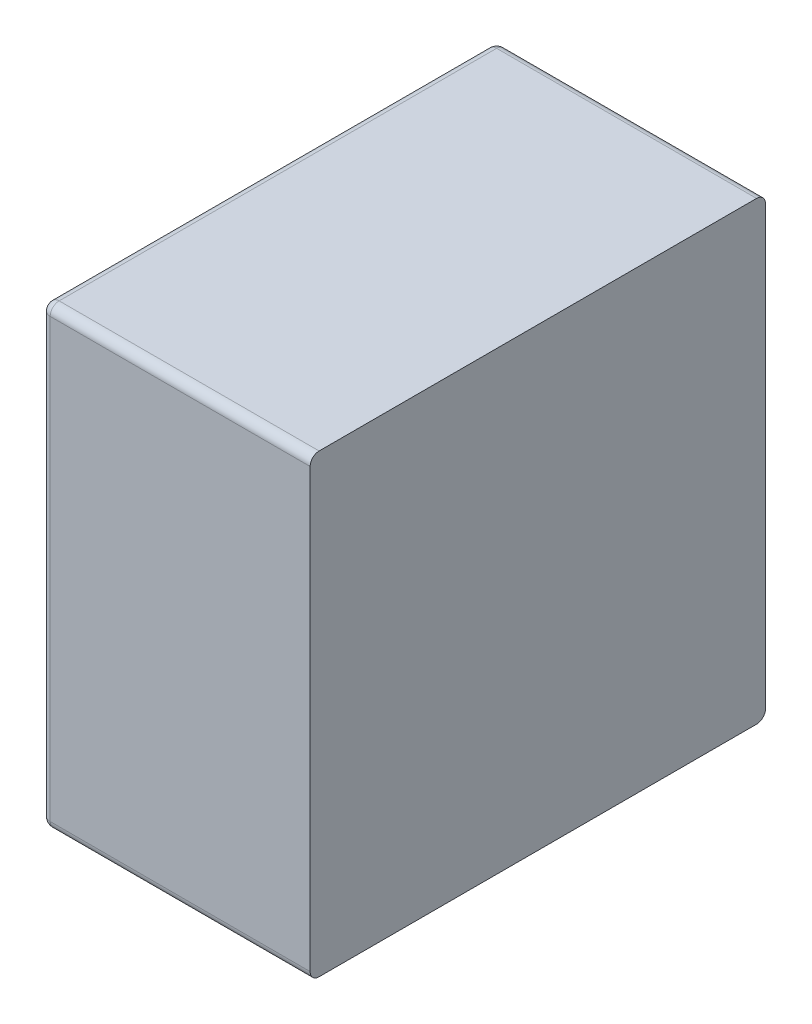
ISO-10303-21;
HEADER;
FILE_DESCRIPTION(('STEP AP214'),'2;1');
FILE_NAME('part.step','',(''),(''),'','','');
FILE_SCHEMA(('AUTOMOTIVE_DESIGN { 1 0 10303 214 1 1 1 1 }'));
ENDSEC;
DATA;
#1=APPLICATION_CONTEXT('core data for automotive mechanical design processes');
#2=APPLICATION_PROTOCOL_DEFINITION('international standard','automotive_design',2000,#1);
#3=PRODUCT_CONTEXT('',#1,'mechanical');
#4=PRODUCT('Part','Part','',(#3));
#5=PRODUCT_RELATED_PRODUCT_CATEGORY('part','',(#4));
#6=PRODUCT_DEFINITION_FORMATION('','',#4);
#7=PRODUCT_DEFINITION_CONTEXT('part definition',#1,'design');
#8=PRODUCT_DEFINITION('design','',#6,#7);
#9=PRODUCT_DEFINITION_SHAPE('','',#8);
#10=(LENGTH_UNIT() NAMED_UNIT(*) SI_UNIT(.MILLI.,.METRE.));
#11=(NAMED_UNIT(*) PLANE_ANGLE_UNIT() SI_UNIT($,.RADIAN.));
#12=(NAMED_UNIT(*) SI_UNIT($,.STERADIAN.) SOLID_ANGLE_UNIT());
#13=UNCERTAINTY_MEASURE_WITH_UNIT(LENGTH_MEASURE(1.E-05),#10,'distance_accuracy_value','');
#14=(GEOMETRIC_REPRESENTATION_CONTEXT(3) GLOBAL_UNCERTAINTY_ASSIGNED_CONTEXT((#13)) GLOBAL_UNIT_ASSIGNED_CONTEXT((#10,
#11,#12)) REPRESENTATION_CONTEXT('',''));
#15=CARTESIAN_POINT('',(0.,0.,0.));
#16=DIRECTION('',(0.,0.,1.));
#17=DIRECTION('',(1.,0.,0.));
#18=AXIS2_PLACEMENT_3D('',#15,#16,#17);
#19=CARTESIAN_POINT('',(20.678297040119,30.214336876006,0.04998827587816));
#20=DIRECTION('',(-0.57735016824285,-0.57735037013685,-0.57735026918916));
#21=DIRECTION('',(-0.707106904820968,0.707106657552106,2.21433982261487E-13));
#22=AXIS2_PLACEMENT_3D('',#19,#20,#21);
#23=SPHERICAL_SURFACE('',#22,0.05);
#24=CARTESIAN_POINT('',(20.6494295317069,30.1854693574992,0.0211207624187029));
#25=VERTEX_POINT('',#24);
#26=VERTEX_LOOP('',#25);
#27=FACE_BOUND('',#26,.T.);
#28=CARTESIAN_POINT('',(20.6782970401187,30.2143368760062,0.0499882758781601));
#29=DIRECTION('',(0.999999999999985,1.74845553146897E-07,0.));
#30=DIRECTION('',(-1.74845553146897E-07,0.999999999999985,0.));
#31=AXIS2_PLACEMENT_3D('',#28,#29,#30);
#32=CIRCLE('',#31,0.05);
#33=CARTESIAN_POINT('',(20.6782970488611,30.1643368760057,0.04998827587816));
#34=VERTEX_POINT('',#33);
#35=CARTESIAN_POINT('',(20.6782968268074,30.2143368760061,-1.17241209315826E-05));
#36=VERTEX_POINT('',#35);
#37=EDGE_CURVE('E110',#34,#36,#32,.T.);
#38=ORIENTED_EDGE('',*,*,#37,.F.);
#39=CARTESIAN_POINT('',(20.678297040119,30.214336876006,0.04998827587816));
#40=DIRECTION('',(0.,0.,1.));
#41=DIRECTION('',(1.,0.,0.));
#42=AXIS2_PLACEMENT_3D('',#39,#40,#41);
#43=CIRCLE('',#42,0.05);
#44=CARTESIAN_POINT('',(20.6282970401188,30.2143368672634,0.04998827587816));
#45=VERTEX_POINT('',#44);
#46=EDGE_CURVE('E21',#45,#34,#43,.T.);
#47=ORIENTED_EDGE('',*,*,#46,.F.);
#48=CARTESIAN_POINT('',(20.6782970401185,30.214336876006,0.0499882758781601));
#49=DIRECTION('',(1.74845553256197E-07,-0.999999999999985,0.));
#50=DIRECTION('',(0.999999999999985,1.74845553256197E-07,0.));
#51=AXIS2_PLACEMENT_3D('',#48,#49,#50);
#52=CIRCLE('',#51,0.05);
#53=EDGE_CURVE('E111',#36,#45,#52,.F.);
#54=ORIENTED_EDGE('',*,*,#53,.F.);
#55=EDGE_LOOP('',(#38,#47,#54));
#56=FACE_BOUND('',#55,.T.);
#57=ADVANCED_FACE('F17',(#27,#56),#23,.T.);
#58=CARTESIAN_POINT('',(20.678296613496,32.654336876006,0.04998827587816));
#59=DIRECTION('',(-0.57735037013735,0.57735016824235,-0.57735026918916));
#60=DIRECTION('',(0.707106657551697,0.707106904821376,-1.86822779468798E-13));
#61=AXIS2_PLACEMENT_3D('',#58,#59,#60);
#62=SPHERICAL_SURFACE('',#61,0.05);
#63=CARTESIAN_POINT('',(20.6494290949891,32.6832043844181,0.0211207624187029));
#64=VERTEX_POINT('',#63);
#65=VERTEX_LOOP('',#64);
#66=FACE_BOUND('',#65,.T.);
#67=CARTESIAN_POINT('',(20.678296613496,32.654336876006,0.0499882758781503));
#68=DIRECTION('',(-0.999999999999985,-1.74845553146897E-07,0.));
#69=DIRECTION('',(1.74845553146897E-07,-0.999999999999985,0.));
#70=AXIS2_PLACEMENT_3D('',#67,#68,#69);
#71=CIRCLE('',#70,0.05);
#72=CARTESIAN_POINT('',(20.6782966134957,32.6543370027686,-1.17241218441212E-05));
#73=VERTEX_POINT('',#72);
#74=CARTESIAN_POINT('',(20.6782966047539,32.704336876006,0.049988275878155));
#75=VERTEX_POINT('',#74);
#76=EDGE_CURVE('E192',#73,#75,#71,.F.);
#77=ORIENTED_EDGE('',*,*,#76,.F.);
#78=CARTESIAN_POINT('',(20.6782966134954,32.6543368760053,0.04998827587816));
#79=DIRECTION('',(1.74845553256197E-07,-0.999999999999985,0.));
#80=DIRECTION('',(0.999999999999985,1.74845553256197E-07,0.));
#81=AXIS2_PLACEMENT_3D('',#78,#79,#80);
#82=CIRCLE('',#81,0.05);
#83=CARTESIAN_POINT('',(20.6282966134957,32.6543368672634,0.04998827587816));
#84=VERTEX_POINT('',#83);
#85=EDGE_CURVE('E200',#84,#73,#82,.T.);
#86=ORIENTED_EDGE('',*,*,#85,.F.);
#87=CARTESIAN_POINT('',(20.678296613496,32.654336876006,0.04998827587816));
#88=DIRECTION('',(0.,0.,1.));
#89=DIRECTION('',(1.,0.,0.));
#90=AXIS2_PLACEMENT_3D('',#87,#88,#89);
#91=CIRCLE('',#90,0.05);
#92=EDGE_CURVE('E172',#75,#84,#91,.T.);
#93=ORIENTED_EDGE('',*,*,#92,.F.);
#94=EDGE_LOOP('',(#77,#86,#93));
#95=FACE_BOUND('',#94,.T.);
#96=ADVANCED_FACE('F108',(#66,#95),#62,.T.);
#97=CARTESIAN_POINT('',(20.628296604754,32.704336867263,-1.172412184487E-05));
#98=DIRECTION('',(-0.999999999999985,-1.74845553256197E-07,0.));
#99=DIRECTION('',(1.74845553256197E-07,-0.999999999999985,0.));
#100=AXIS2_PLACEMENT_3D('',#97,#98,#99);
#101=PLANE('',#100);
#102=DIRECTION('',(0.,0.,1.));
#103=VECTOR('',#102,1.);
#104=CARTESIAN_POINT('',(20.628297040119,30.214336867263,-1.1724121844787E-05));
#105=LINE('',#104,#103);
#106=CARTESIAN_POINT('',(20.6282970401188,30.2143368672634,2.489988275878));
#107=VERTEX_POINT('',#106);
#108=EDGE_CURVE('E117',#107,#45,#105,.F.);
#109=ORIENTED_EDGE('',*,*,#108,.F.);
#110=DIRECTION('',(1.74845553256197E-07,-0.999999999999985,0.));
#111=VECTOR('',#110,1.);
#112=CARTESIAN_POINT('',(20.62829671578,32.0693368672637,2.489988275878));
#113=LINE('',#112,#111);
#114=CARTESIAN_POINT('',(20.6282966134957,32.6543368672634,2.489988275878));
#115=VERTEX_POINT('',#114);
#116=EDGE_CURVE('E167',#115,#107,#113,.T.);
#117=ORIENTED_EDGE('',*,*,#116,.F.);
#118=DIRECTION('',(0.,0.,1.));
#119=VECTOR('',#118,1.);
#120=CARTESIAN_POINT('',(20.628296613496,32.654336867263,-1.1724121844867E-05));
#121=LINE('',#120,#119);
#122=EDGE_CURVE('E168',#84,#115,#121,.T.);
#123=ORIENTED_EDGE('',*,*,#122,.F.);
#124=DIRECTION('',(1.74845553256197E-07,-0.999999999999985,0.));
#125=VECTOR('',#124,1.);
#126=CARTESIAN_POINT('',(20.62829671578,32.0693368672637,0.0499882758781599));
#127=LINE('',#126,#125);
#128=EDGE_CURVE('E173',#45,#84,#127,.F.);
#129=ORIENTED_EDGE('',*,*,#128,.F.);
#130=EDGE_LOOP('',(#109,#117,#123,#129));
#131=FACE_BOUND('',#130,.T.);
#132=ADVANCED_FACE('F159',(#131),#101,.T.);
#133=CARTESIAN_POINT('',(20.678297040119,30.214336876006,2.489988275878));
#134=DIRECTION('',(-0.577350168242579,-0.577350370136641,0.577350269189641));
#135=DIRECTION('',(-1.2363454196529E-07,0.707106781186642,0.707106781186442));
#136=AXIS2_PLACEMENT_3D('',#133,#134,#135);
#137=SPHERICAL_SURFACE('',#136,0.05);
#138=CARTESIAN_POINT('',(20.6494295317069,30.1854693574992,2.51885578933748));
#139=VERTEX_POINT('',#138);
#140=VERTEX_LOOP('',#139);
#141=FACE_BOUND('',#140,.T.);
#142=CARTESIAN_POINT('',(20.678297040119,30.2143368760062,2.489988275878));
#143=DIRECTION('',(0.999999999999985,1.74845553146897E-07,0.));
#144=DIRECTION('',(-1.74845553146897E-07,0.999999999999985,0.));
#145=AXIS2_PLACEMENT_3D('',#142,#143,#144);
#146=CIRCLE('',#145,0.05);
#147=CARTESIAN_POINT('',(20.6782968268075,30.2143368760056,2.539988275878));
#148=VERTEX_POINT('',#147);
#149=CARTESIAN_POINT('',(20.6782970488611,30.1643368760057,2.489988275878));
#150=VERTEX_POINT('',#149);
#151=EDGE_CURVE('E182',#148,#150,#146,.T.);
#152=ORIENTED_EDGE('',*,*,#151,.F.);
#153=CARTESIAN_POINT('',(20.6782970401185,30.2143368760053,2.489988275878));
#154=DIRECTION('',(1.74845553256197E-07,-0.999999999999985,0.));
#155=DIRECTION('',(0.999999999999985,1.74845553256197E-07,0.));
#156=AXIS2_PLACEMENT_3D('',#153,#154,#155);
#157=CIRCLE('',#156,0.05);
#158=EDGE_CURVE('E184',#107,#148,#157,.F.);
#159=ORIENTED_EDGE('',*,*,#158,.F.);
#160=CARTESIAN_POINT('',(20.678297040119,30.214336876006,2.489988275878));
#161=DIRECTION('',(0.,0.,1.));
#162=DIRECTION('',(1.,0.,0.));
#163=AXIS2_PLACEMENT_3D('',#160,#161,#162);
#164=CIRCLE('',#163,0.05);
#165=EDGE_CURVE('E127',#150,#107,#164,.F.);
#166=ORIENTED_EDGE('',*,*,#165,.F.);
#167=EDGE_LOOP('',(#152,#159,#166));
#168=FACE_BOUND('',#167,.T.);
#169=ADVANCED_FACE('F155',(#141,#168),#137,.T.);
#170=CARTESIAN_POINT('',(20.678296613496,32.654336876006,2.489988275878));
#171=DIRECTION('',(-0.577350370136641,0.577350168242579,0.577350269189641));
#172=DIRECTION('',(-0.707106781186642,-1.2363454196529E-07,-0.707106781186442));
#173=AXIS2_PLACEMENT_3D('',#170,#171,#172);
#174=SPHERICAL_SURFACE('',#173,0.05);
#175=CARTESIAN_POINT('',(20.6494290949892,32.6832043844181,2.51885578933748));
#176=VERTEX_POINT('',#175);
#177=VERTEX_LOOP('',#176);
#178=FACE_BOUND('',#177,.T.);
#179=CARTESIAN_POINT('',(20.6782966134963,32.654336876006,2.489988275878));
#180=DIRECTION('',(-0.999999999999985,-1.74845553146897E-07,0.));
#181=DIRECTION('',(1.74845553146897E-07,-0.999999999999985,0.));
#182=AXIS2_PLACEMENT_3D('',#179,#180,#181);
#183=CIRCLE('',#182,0.05);
#184=CARTESIAN_POINT('',(20.6782966047539,32.704336876006,2.489988275878));
#185=VERTEX_POINT('',#184);
#186=CARTESIAN_POINT('',(20.6782966134958,32.654337002769,2.53998827587768));
#187=VERTEX_POINT('',#186);
#188=EDGE_CURVE('E140',#185,#187,#183,.F.);
#189=ORIENTED_EDGE('',*,*,#188,.F.);
#190=CARTESIAN_POINT('',(20.678296613496,32.654336876006,2.489988275878));
#191=DIRECTION('',(0.,0.,1.));
#192=DIRECTION('',(1.,0.,0.));
#193=AXIS2_PLACEMENT_3D('',#190,#191,#192);
#194=CIRCLE('',#193,0.05);
#195=EDGE_CURVE('E171',#115,#185,#194,.F.);
#196=ORIENTED_EDGE('',*,*,#195,.F.);
#197=CARTESIAN_POINT('',(20.6782966134954,32.654336876006,2.489988275878));
#198=DIRECTION('',(1.74845553256197E-07,-0.999999999999985,0.));
#199=DIRECTION('',(0.999999999999985,1.74845553256197E-07,0.));
#200=AXIS2_PLACEMENT_3D('',#197,#198,#199);
#201=CIRCLE('',#200,0.05);
#202=EDGE_CURVE('E187',#187,#115,#201,.T.);
#203=ORIENTED_EDGE('',*,*,#202,.F.);
#204=EDGE_LOOP('',(#189,#196,#203));
#205=FACE_BOUND('',#204,.T.);
#206=ADVANCED_FACE('F151',(#178,#205),#174,.T.);
#207=CARTESIAN_POINT('',(20.678297040119,30.214336876006,-1.17241218448E-05));
#208=DIRECTION('',(0.,0.,1.));
#209=DIRECTION('',(1.,0.,0.));
#210=AXIS2_PLACEMENT_3D('',#207,#208,#209);
#211=CYLINDRICAL_SURFACE('',#210,0.05);
#212=ORIENTED_EDGE('',*,*,#165,.T.);
#213=ORIENTED_EDGE('',*,*,#108,.T.);
#214=ORIENTED_EDGE('',*,*,#46,.T.);
#215=DIRECTION('',(0.,0.,1.));
#216=VECTOR('',#215,1.);
#217=CARTESIAN_POINT('',(20.678297048861,30.1643368760053,-1.172412184479E-05));
#218=LINE('',#217,#216);
#219=EDGE_CURVE('E125',#150,#34,#218,.F.);
#220=ORIENTED_EDGE('',*,*,#219,.F.);
#221=EDGE_LOOP('',(#212,#213,#214,#220));
#222=FACE_BOUND('',#221,.T.);
#223=ADVANCED_FACE('F123',(#222),#211,.T.);
#224=CARTESIAN_POINT('',(21.003297040119,30.214336932831,0.04998827587816));
#225=DIRECTION('',(0.999999999999985,1.74845553146897E-07,0.));
#226=DIRECTION('',(-1.74845553146897E-07,0.999999999999985,0.));
#227=AXIS2_PLACEMENT_3D('',#224,#225,#226);
#228=CYLINDRICAL_SURFACE('',#227,0.05);
#229=CARTESIAN_POINT('',(22.128297040119,30.2143371295322,0.0499882758781597));
#230=DIRECTION('',(0.999999999999985,1.74845553146897E-07,0.));
#231=DIRECTION('',(-1.74845553146897E-07,0.999999999999985,0.));
#232=AXIS2_PLACEMENT_3D('',#229,#230,#231);
#233=CIRCLE('',#232,0.05);
#234=CARTESIAN_POINT('',(22.1282970401189,30.2143370027691,-1.17241218451913E-05));
#235=VERTEX_POINT('',#234);
#236=CARTESIAN_POINT('',(22.1282970488613,30.1643371295317,0.0499882758781599));
#237=VERTEX_POINT('',#236);
#238=EDGE_CURVE('E116',#235,#237,#233,.F.);
#239=ORIENTED_EDGE('',*,*,#238,.T.);
#240=DIRECTION('',(0.999999999999985,1.74845553146897E-07,0.));
#241=VECTOR('',#240,1.);
#242=CARTESIAN_POINT('',(20.628297048861,30.164336867263,0.04998827587816));
#243=LINE('',#242,#241);
#244=EDGE_CURVE('E129',#34,#237,#243,.T.);
#245=ORIENTED_EDGE('',*,*,#244,.F.);
#246=ORIENTED_EDGE('',*,*,#37,.T.);
#247=DIRECTION('',(1.,0.,0.));
#248=VECTOR('',#247,1.);
#249=CARTESIAN_POINT('',(21.378296826807,30.214336876006,-1.17241218449783E-05));
#250=LINE('',#249,#248);
#251=EDGE_CURVE('E240',#36,#235,#250,.T.);
#252=ORIENTED_EDGE('',*,*,#251,.T.);
#253=EDGE_LOOP('',(#239,#245,#246,#252));
#254=FACE_BOUND('',#253,.T.);
#255=ADVANCED_FACE('F130',(#254),#228,.T.);
#256=CARTESIAN_POINT('',(20.67829671578,32.069336876006,0.04998827587816));
#257=DIRECTION('',(1.74845553256197E-07,-0.999999999999985,0.));
#258=DIRECTION('',(0.999999999999985,1.74845553256197E-07,0.));
#259=AXIS2_PLACEMENT_3D('',#256,#257,#258);
#260=CYLINDRICAL_SURFACE('',#259,0.05);
#261=ORIENTED_EDGE('',*,*,#53,.T.);
#262=ORIENTED_EDGE('',*,*,#128,.T.);
#263=ORIENTED_EDGE('',*,*,#85,.T.);
#264=DIRECTION('',(0.,1.,0.));
#265=VECTOR('',#264,1.);
#266=CARTESIAN_POINT('',(20.678296613496,31.434336998398,-1.17241218448379E-05));
#267=LINE('',#266,#265);
#268=EDGE_CURVE('E144',#73,#36,#267,.F.);
#269=ORIENTED_EDGE('',*,*,#268,.T.);
#270=EDGE_LOOP('',(#261,#262,#263,#269));
#271=FACE_BOUND('',#270,.T.);
#272=ADVANCED_FACE('F341',(#271),#260,.T.);
#273=CARTESIAN_POINT('',(20.678296613496,32.654336876006,-1.172412184488E-05));
#274=DIRECTION('',(0.,0.,1.));
#275=DIRECTION('',(1.,0.,0.));
#276=AXIS2_PLACEMENT_3D('',#273,#274,#275);
#277=CYLINDRICAL_SURFACE('',#276,0.05);
#278=ORIENTED_EDGE('',*,*,#195,.T.);
#279=DIRECTION('',(0.,0.,1.));
#280=VECTOR('',#279,1.);
#281=CARTESIAN_POINT('',(20.678296604754,32.7043368760059,-1.172412184526E-05));
#282=LINE('',#281,#280);
#283=EDGE_CURVE('E229',#75,#185,#282,.T.);
#284=ORIENTED_EDGE('',*,*,#283,.F.);
#285=ORIENTED_EDGE('',*,*,#92,.T.);
#286=ORIENTED_EDGE('',*,*,#122,.T.);
#287=EDGE_LOOP('',(#278,#284,#285,#286));
#288=FACE_BOUND('',#287,.T.);
#289=ADVANCED_FACE('F332',(#288),#277,.T.);
#290=CARTESIAN_POINT('',(21.753296613496,32.654337063965,0.04998827587815));
#291=DIRECTION('',(-0.999999999999985,-1.74845553146897E-07,0.));
#292=DIRECTION('',(1.74845553146897E-07,-0.999999999999985,0.));
#293=AXIS2_PLACEMENT_3D('',#290,#291,#292);
#294=CYLINDRICAL_SURFACE('',#293,0.05);
#295=CARTESIAN_POINT('',(22.1282966134963,32.6543371295321,0.0499882758781499));
#296=DIRECTION('',(-0.999999999999985,-1.74845553146897E-07,0.));
#297=DIRECTION('',(1.74845553146897E-07,-0.999999999999985,0.));
#298=AXIS2_PLACEMENT_3D('',#295,#296,#297);
#299=CIRCLE('',#298,0.05);
#300=CARTESIAN_POINT('',(22.1282966047536,32.704337129532,0.04998827587815));
#301=VERTEX_POINT('',#300);
#302=CARTESIAN_POINT('',(22.1282966134959,32.654337129532,-1.17241218452121E-05));
#303=VERTEX_POINT('',#302);
#304=EDGE_CURVE('E190',#301,#303,#299,.T.);
#305=ORIENTED_EDGE('',*,*,#304,.T.);
#306=DIRECTION('',(1.,0.,0.));
#307=VECTOR('',#306,1.);
#308=CARTESIAN_POINT('',(21.378296826807,32.654337129532,-1.17241218450617E-05));
#309=LINE('',#308,#307);
#310=EDGE_CURVE('E235',#303,#73,#309,.F.);
#311=ORIENTED_EDGE('',*,*,#310,.T.);
#312=ORIENTED_EDGE('',*,*,#76,.T.);
#313=DIRECTION('',(-0.999999999999985,-1.74845553146897E-07,0.));
#314=VECTOR('',#313,1.);
#315=CARTESIAN_POINT('',(22.128296604754,32.704337129532,0.04998827587815));
#316=LINE('',#315,#314);
#317=EDGE_CURVE('E223',#301,#75,#316,.T.);
#318=ORIENTED_EDGE('',*,*,#317,.F.);
#319=EDGE_LOOP('',(#305,#311,#312,#318));
#320=FACE_BOUND('',#319,.T.);
#321=ADVANCED_FACE('F323',(#320),#294,.T.);
#322=CARTESIAN_POINT('',(20.67829671578,32.069336876006,2.489988275878));
#323=DIRECTION('',(1.74845553256197E-07,-0.999999999999985,0.));
#324=DIRECTION('',(0.999999999999985,1.74845553256197E-07,0.));
#325=AXIS2_PLACEMENT_3D('',#322,#323,#324);
#326=CYLINDRICAL_SURFACE('',#325,0.05);
#327=ORIENTED_EDGE('',*,*,#158,.T.);
#328=DIRECTION('',(0.,1.,0.));
#329=VECTOR('',#328,1.);
#330=CARTESIAN_POINT('',(20.678296613496,31.434336998398,2.539988275878));
#331=LINE('',#330,#329);
#332=EDGE_CURVE('E211',#187,#148,#331,.F.);
#333=ORIENTED_EDGE('',*,*,#332,.F.);
#334=ORIENTED_EDGE('',*,*,#202,.T.);
#335=ORIENTED_EDGE('',*,*,#116,.T.);
#336=EDGE_LOOP('',(#327,#333,#334,#335));
#337=FACE_BOUND('',#336,.T.);
#338=ADVANCED_FACE('F209',(#337),#326,.T.);
#339=CARTESIAN_POINT('',(21.003297040119,30.214336932831,2.489988275878));
#340=DIRECTION('',(0.999999999999985,1.74845553146897E-07,0.));
#341=DIRECTION('',(-1.74845553146897E-07,0.999999999999985,0.));
#342=AXIS2_PLACEMENT_3D('',#339,#340,#341);
#343=CYLINDRICAL_SURFACE('',#342,0.05);
#344=CARTESIAN_POINT('',(22.1282970401187,30.2143371295322,2.489988275878));
#345=DIRECTION('',(0.999999999999985,1.74845553146897E-07,0.));
#346=DIRECTION('',(-1.74845553146897E-07,0.999999999999985,0.));
#347=AXIS2_PLACEMENT_3D('',#344,#345,#346);
#348=CIRCLE('',#347,0.05);
#349=CARTESIAN_POINT('',(22.128297048861,30.1643371295317,2.489988275878));
#350=VERTEX_POINT('',#349);
#351=CARTESIAN_POINT('',(22.1282970401187,30.2143370027691,2.539988275878));
#352=VERTEX_POINT('',#351);
#353=EDGE_CURVE('E180',#350,#352,#348,.F.);
#354=ORIENTED_EDGE('',*,*,#353,.T.);
#355=DIRECTION('',(1.,0.,0.));
#356=VECTOR('',#355,1.);
#357=CARTESIAN_POINT('',(21.378296826807,30.214336876006,2.539988275878));
#358=LINE('',#357,#356);
#359=EDGE_CURVE('E215',#148,#352,#358,.T.);
#360=ORIENTED_EDGE('',*,*,#359,.F.);
#361=ORIENTED_EDGE('',*,*,#151,.T.);
#362=DIRECTION('',(0.999999999999985,1.74845553146897E-07,0.));
#363=VECTOR('',#362,1.);
#364=CARTESIAN_POINT('',(20.628297048861,30.164336867263,2.489988275878));
#365=LINE('',#364,#363);
#366=EDGE_CURVE('E134',#350,#150,#365,.F.);
#367=ORIENTED_EDGE('',*,*,#366,.F.);
#368=EDGE_LOOP('',(#354,#360,#361,#367));
#369=FACE_BOUND('',#368,.T.);
#370=ADVANCED_FACE('F216',(#369),#343,.T.);
#371=CARTESIAN_POINT('',(21.753296613496,32.654337063965,2.489988275878));
#372=DIRECTION('',(-0.999999999999985,-1.74845553146897E-07,0.));
#373=DIRECTION('',(1.74845553146897E-07,-0.999999999999985,0.));
#374=AXIS2_PLACEMENT_3D('',#371,#372,#373);
#375=CYLINDRICAL_SURFACE('',#374,0.05);
#376=CARTESIAN_POINT('',(22.128296613496,32.6543371295321,2.489988275878));
#377=DIRECTION('',(-0.999999999999985,-1.74845553146897E-07,0.));
#378=DIRECTION('',(1.74845553146897E-07,-0.999999999999985,0.));
#379=AXIS2_PLACEMENT_3D('',#376,#377,#378);
#380=CIRCLE('',#379,0.05);
#381=CARTESIAN_POINT('',(22.1282966134958,32.654337129532,2.539988275878));
#382=VERTEX_POINT('',#381);
#383=CARTESIAN_POINT('',(22.1282966047535,32.704337129532,2.489988275878));
#384=VERTEX_POINT('',#383);
#385=EDGE_CURVE('E35',#382,#384,#380,.T.);
#386=ORIENTED_EDGE('',*,*,#385,.T.);
#387=DIRECTION('',(-0.999999999999985,-1.74845553146897E-07,0.));
#388=VECTOR('',#387,1.);
#389=CARTESIAN_POINT('',(22.128296604754,32.704337129532,2.489988275878));
#390=LINE('',#389,#388);
#391=EDGE_CURVE('E226',#185,#384,#390,.F.);
#392=ORIENTED_EDGE('',*,*,#391,.F.);
#393=ORIENTED_EDGE('',*,*,#188,.T.);
#394=DIRECTION('',(1.,0.,0.));
#395=VECTOR('',#394,1.);
#396=CARTESIAN_POINT('',(21.378296826807,32.654337129532,2.539988275878));
#397=LINE('',#396,#395);
#398=EDGE_CURVE('E219',#382,#187,#397,.F.);
#399=ORIENTED_EDGE('',*,*,#398,.F.);
#400=EDGE_LOOP('',(#386,#392,#393,#399));
#401=FACE_BOUND('',#400,.T.);
#402=ADVANCED_FACE('F258',(#401),#375,.T.);
#403=CARTESIAN_POINT('',(20.628297048861,30.164336867263,-1.172412184479E-05));
#404=DIRECTION('',(1.74845553146897E-07,-0.999999999999985,0.));
#405=DIRECTION('',(0.999999999999985,1.74845553146897E-07,0.));
#406=AXIS2_PLACEMENT_3D('',#403,#404,#405);
#407=PLANE('',#406);
#408=DIRECTION('',(0.,0.,1.));
#409=VECTOR('',#408,1.);
#410=CARTESIAN_POINT('',(22.128297048861,30.164337129532,-1.172412184518E-05));
#411=LINE('',#410,#409);
#412=EDGE_CURVE('E247',#350,#237,#411,.F.);
#413=ORIENTED_EDGE('',*,*,#412,.F.);
#414=ORIENTED_EDGE('',*,*,#366,.T.);
#415=ORIENTED_EDGE('',*,*,#219,.T.);
#416=ORIENTED_EDGE('',*,*,#244,.T.);
#417=EDGE_LOOP('',(#413,#414,#415,#416));
#418=FACE_BOUND('',#417,.T.);
#419=ADVANCED_FACE('F137',(#418),#407,.T.);
#420=CARTESIAN_POINT('',(21.378296826807,31.434336998398,-1.172412184502E-05));
#421=DIRECTION('',(0.,0.,1.));
#422=DIRECTION('',(1.,0.,0.));
#423=AXIS2_PLACEMENT_3D('',#420,#421,#422);
#424=PLANE('',#423);
#425=ORIENTED_EDGE('',*,*,#310,.F.);
#426=DIRECTION('',(-1.74845553146897E-07,0.999999999999985,0.));
#427=VECTOR('',#426,1.);
#428=CARTESIAN_POINT('',(22.128297048861,30.164337129532,-1.172412184518E-05));
#429=LINE('',#428,#427);
#430=EDGE_CURVE('E249',#235,#303,#429,.T.);
#431=ORIENTED_EDGE('',*,*,#430,.F.);
#432=ORIENTED_EDGE('',*,*,#251,.F.);
#433=ORIENTED_EDGE('',*,*,#268,.F.);
#434=EDGE_LOOP('',(#425,#431,#432,#433));
#435=FACE_BOUND('',#434,.T.);
#436=ADVANCED_FACE('F261',(#435),#424,.F.);
#437=CARTESIAN_POINT('',(22.128296604754,32.704337129532,-1.172412184526E-05));
#438=DIRECTION('',(-1.74845553146897E-07,0.999999999999985,0.));
#439=DIRECTION('',(-0.999999999999985,-1.74845553146897E-07,0.));
#440=AXIS2_PLACEMENT_3D('',#437,#438,#439);
#441=PLANE('',#440);
#442=DIRECTION('',(0.,0.,1.));
#443=VECTOR('',#442,1.);
#444=CARTESIAN_POINT('',(22.1282966047533,32.704337129532,-1.172412184518E-05));
#445=LINE('',#444,#443);
#446=EDGE_CURVE('E27',#301,#384,#445,.T.);
#447=ORIENTED_EDGE('',*,*,#446,.F.);
#448=ORIENTED_EDGE('',*,*,#317,.T.);
#449=ORIENTED_EDGE('',*,*,#283,.T.);
#450=ORIENTED_EDGE('',*,*,#391,.T.);
#451=EDGE_LOOP('',(#447,#448,#449,#450));
#452=FACE_BOUND('',#451,.T.);
#453=ADVANCED_FACE('F255',(#452),#441,.T.);
#454=CARTESIAN_POINT('',(21.378296826807,31.434336998398,2.539988275878));
#455=DIRECTION('',(0.,0.,1.));
#456=DIRECTION('',(1.,0.,0.));
#457=AXIS2_PLACEMENT_3D('',#454,#455,#456);
#458=PLANE('',#457);
#459=DIRECTION('',(-1.74845553146897E-07,0.999999999999985,0.));
#460=VECTOR('',#459,1.);
#461=CARTESIAN_POINT('',(22.128297048861,30.164337129532,2.539988275878));
#462=LINE('',#461,#460);
#463=EDGE_CURVE('E11',#382,#352,#462,.F.);
#464=ORIENTED_EDGE('',*,*,#463,.F.);
#465=ORIENTED_EDGE('',*,*,#398,.T.);
#466=ORIENTED_EDGE('',*,*,#332,.T.);
#467=ORIENTED_EDGE('',*,*,#359,.T.);
#468=EDGE_LOOP('',(#464,#465,#466,#467));
#469=FACE_BOUND('',#468,.T.);
#470=ADVANCED_FACE('F222',(#469),#458,.T.);
#471=CARTESIAN_POINT('',(22.128297048861,30.164337129532,-1.172412184518E-05));
#472=DIRECTION('',(0.999999999999985,1.74845553146897E-07,0.));
#473=DIRECTION('',(-1.74845553146897E-07,0.999999999999985,0.));
#474=AXIS2_PLACEMENT_3D('',#471,#472,#473);
#475=PLANE('',#474);
#476=ORIENTED_EDGE('',*,*,#385,.F.);
#477=ORIENTED_EDGE('',*,*,#463,.T.);
#478=ORIENTED_EDGE('',*,*,#353,.F.);
#479=ORIENTED_EDGE('',*,*,#412,.T.);
#480=ORIENTED_EDGE('',*,*,#238,.F.);
#481=ORIENTED_EDGE('',*,*,#430,.T.);
#482=ORIENTED_EDGE('',*,*,#304,.F.);
#483=ORIENTED_EDGE('',*,*,#446,.T.);
#484=EDGE_LOOP('',(#476,#477,#478,#479,#480,#481,#482,#483));
#485=FACE_BOUND('',#484,.T.);
#486=ADVANCED_FACE('F253',(#485),#475,.T.);
#487=CLOSED_SHELL('',(#57,#96,#132,#169,#206,#223,#255,#272,#289,#321,#338,#370,#402,#419,#436,
#453,#470,#486));
#488=MANIFOLD_SOLID_BREP('B1',#487);
#489=ADVANCED_BREP_SHAPE_REPRESENTATION('',(#18,#488),#14);
#490=SHAPE_DEFINITION_REPRESENTATION(#9,#489);
ENDSEC;
END-ISO-10303-21;
